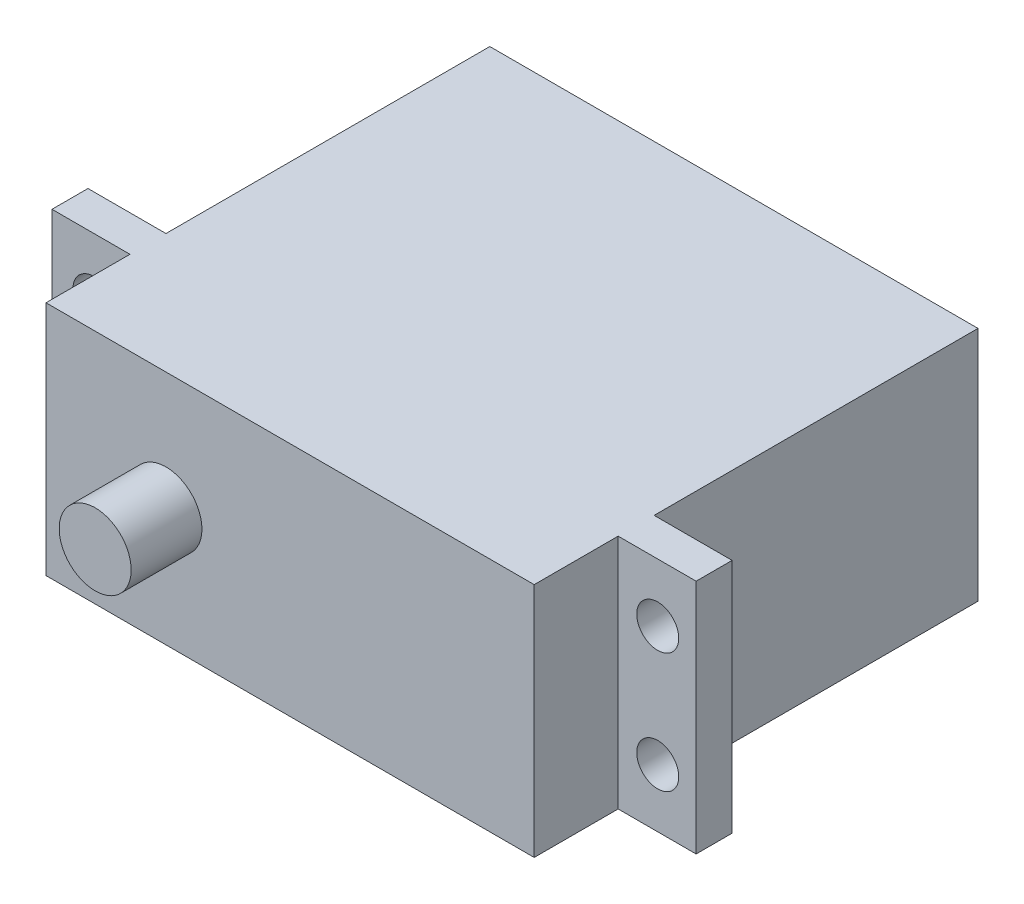
ISO-10303-21;
HEADER;
FILE_DESCRIPTION(('STEP AP214'),'2;1');
FILE_NAME('part.step','',(''),(''),'','','');
FILE_SCHEMA(('AUTOMOTIVE_DESIGN { 1 0 10303 214 1 1 1 1 }'));
ENDSEC;
DATA;
#1=APPLICATION_CONTEXT('core data for automotive mechanical design processes');
#2=APPLICATION_PROTOCOL_DEFINITION('international standard','automotive_design',2000,#1);
#3=PRODUCT_CONTEXT('',#1,'mechanical');
#4=PRODUCT('Part','Part','',(#3));
#5=PRODUCT_RELATED_PRODUCT_CATEGORY('part','',(#4));
#6=PRODUCT_DEFINITION_FORMATION('','',#4);
#7=PRODUCT_DEFINITION_CONTEXT('part definition',#1,'design');
#8=PRODUCT_DEFINITION('design','',#6,#7);
#9=PRODUCT_DEFINITION_SHAPE('','',#8);
#10=(LENGTH_UNIT() NAMED_UNIT(*) SI_UNIT(.MILLI.,.METRE.));
#11=(NAMED_UNIT(*) PLANE_ANGLE_UNIT() SI_UNIT($,.RADIAN.));
#12=(NAMED_UNIT(*) SI_UNIT($,.STERADIAN.) SOLID_ANGLE_UNIT());
#13=UNCERTAINTY_MEASURE_WITH_UNIT(LENGTH_MEASURE(1.E-05),#10,'distance_accuracy_value','');
#14=(GEOMETRIC_REPRESENTATION_CONTEXT(3) GLOBAL_UNCERTAINTY_ASSIGNED_CONTEXT((#13)) GLOBAL_UNIT_ASSIGNED_CONTEXT((#10,
#11,#12)) REPRESENTATION_CONTEXT('',''));
#15=CARTESIAN_POINT('',(0.,0.,0.));
#16=DIRECTION('',(0.,0.,1.));
#17=DIRECTION('',(1.,0.,0.));
#18=AXIS2_PLACEMENT_3D('',#15,#16,#17);
#19=CARTESIAN_POINT('',(-10.,-9.85,7.));
#20=DIRECTION('',(1.,0.,0.));
#21=DIRECTION('',(0.,0.,-1.));
#22=AXIS2_PLACEMENT_3D('',#19,#20,#21);
#23=PLANE('',#22);
#24=DIRECTION('',(0.,1.,0.));
#25=VECTOR('',#24,1.);
#26=CARTESIAN_POINT('',(-10.,-9.85,0.));
#27=LINE('',#26,#25);
#28=CARTESIAN_POINT('',(-10.,-9.85,0.));
#29=VERTEX_POINT('',#28);
#30=CARTESIAN_POINT('',(-10.,9.85,0.));
#31=VERTEX_POINT('',#30);
#32=EDGE_CURVE('E158',#29,#31,#27,.T.);
#33=ORIENTED_EDGE('',*,*,#32,.F.);
#34=DIRECTION('',(0.,0.,-1.));
#35=VECTOR('',#34,1.);
#36=CARTESIAN_POINT('',(-10.,-9.85,7.));
#37=LINE('',#36,#35);
#38=CARTESIAN_POINT('',(-10.,-9.85,7.));
#39=VERTEX_POINT('',#38);
#40=EDGE_CURVE('E139',#39,#29,#37,.T.);
#41=ORIENTED_EDGE('',*,*,#40,.F.);
#42=DIRECTION('',(0.,-1.,0.));
#43=VECTOR('',#42,1.);
#44=CARTESIAN_POINT('',(-10.,-9.85,7.));
#45=LINE('',#44,#43);
#46=CARTESIAN_POINT('',(-10.,9.85,7.));
#47=VERTEX_POINT('',#46);
#48=EDGE_CURVE('E166',#47,#39,#45,.T.);
#49=ORIENTED_EDGE('',*,*,#48,.F.);
#50=DIRECTION('',(0.,0.,-1.));
#51=VECTOR('',#50,1.);
#52=CARTESIAN_POINT('',(-10.,9.85,7.));
#53=LINE('',#52,#51);
#54=EDGE_CURVE('E186',#47,#31,#53,.T.);
#55=ORIENTED_EDGE('',*,*,#54,.T.);
#56=EDGE_LOOP('',(#33,#41,#49,#55));
#57=FACE_BOUND('',#56,.T.);
#58=ADVANCED_FACE('F39',(#57),#23,.F.);
#59=CARTESIAN_POINT('',(30.7,-9.85,7.));
#60=DIRECTION('',(-1.,0.,0.));
#61=DIRECTION('',(0.,0.,1.));
#62=AXIS2_PLACEMENT_3D('',#59,#60,#61);
#63=PLANE('',#62);
#64=DIRECTION('',(0.,-1.,0.));
#65=VECTOR('',#64,1.);
#66=CARTESIAN_POINT('',(30.7,-9.85,0.));
#67=LINE('',#66,#65);
#68=CARTESIAN_POINT('',(30.7,9.85,0.));
#69=VERTEX_POINT('',#68);
#70=CARTESIAN_POINT('',(30.7,-9.85,0.));
#71=VERTEX_POINT('',#70);
#72=EDGE_CURVE('E48',#69,#71,#67,.T.);
#73=ORIENTED_EDGE('',*,*,#72,.F.);
#74=DIRECTION('',(0.,0.,-1.));
#75=VECTOR('',#74,1.);
#76=CARTESIAN_POINT('',(30.7,9.85,7.));
#77=LINE('',#76,#75);
#78=CARTESIAN_POINT('',(30.7,9.85,7.));
#79=VERTEX_POINT('',#78);
#80=EDGE_CURVE('E194',#79,#69,#77,.T.);
#81=ORIENTED_EDGE('',*,*,#80,.F.);
#82=DIRECTION('',(0.,1.,0.));
#83=VECTOR('',#82,1.);
#84=CARTESIAN_POINT('',(30.7,-9.85,7.));
#85=LINE('',#84,#83);
#86=CARTESIAN_POINT('',(30.7,-9.85,7.));
#87=VERTEX_POINT('',#86);
#88=EDGE_CURVE('E172',#87,#79,#85,.T.);
#89=ORIENTED_EDGE('',*,*,#88,.F.);
#90=DIRECTION('',(0.,0.,-1.));
#91=VECTOR('',#90,1.);
#92=CARTESIAN_POINT('',(30.7,-9.85,7.));
#93=LINE('',#92,#91);
#94=EDGE_CURVE('E200',#87,#71,#93,.T.);
#95=ORIENTED_EDGE('',*,*,#94,.T.);
#96=EDGE_LOOP('',(#73,#81,#89,#95));
#97=FACE_BOUND('',#96,.T.);
#98=ADVANCED_FACE('F284',(#97),#63,.F.);
#99=CARTESIAN_POINT('',(-10.,-9.85,-3.));
#100=VERTEX_POINT('',#99);
#101=CARTESIAN_POINT('',(-10.,-9.85,-30.));
#102=VERTEX_POINT('',#101);
#103=EDGE_CURVE('E199',#100,#102,#37,.T.);
#104=ORIENTED_EDGE('',*,*,#103,.F.);
#105=DIRECTION('',(0.,1.,0.));
#106=VECTOR('',#105,1.);
#107=CARTESIAN_POINT('',(-10.,-9.85,-3.));
#108=LINE('',#107,#106);
#109=CARTESIAN_POINT('',(-10.,9.85,-3.));
#110=VERTEX_POINT('',#109);
#111=EDGE_CURVE('E156',#100,#110,#108,.T.);
#112=ORIENTED_EDGE('',*,*,#111,.T.);
#113=CARTESIAN_POINT('',(-10.,9.85,-30.));
#114=VERTEX_POINT('',#113);
#115=EDGE_CURVE('E178',#110,#114,#53,.T.);
#116=ORIENTED_EDGE('',*,*,#115,.T.);
#117=DIRECTION('',(0.,-1.,0.));
#118=VECTOR('',#117,1.);
#119=CARTESIAN_POINT('',(-10.,-9.85,-30.));
#120=LINE('',#119,#118);
#121=EDGE_CURVE('E170',#114,#102,#120,.T.);
#122=ORIENTED_EDGE('',*,*,#121,.T.);
#123=EDGE_LOOP('',(#104,#112,#116,#122));
#124=FACE_BOUND('',#123,.T.);
#125=ADVANCED_FACE('F41',(#124),#23,.F.);
#126=CARTESIAN_POINT('',(-10.,-9.85,7.));
#127=DIRECTION('',(0.,1.,0.));
#128=DIRECTION('',(0.,0.,1.));
#129=AXIS2_PLACEMENT_3D('',#126,#127,#128);
#130=PLANE('',#129);
#131=ORIENTED_EDGE('',*,*,#40,.T.);
#132=DIRECTION('',(1.,0.,0.));
#133=VECTOR('',#132,1.);
#134=CARTESIAN_POINT('',(-16.5,-9.85,0.));
#135=LINE('',#134,#133);
#136=CARTESIAN_POINT('',(-16.5,-9.85,0.));
#137=VERTEX_POINT('',#136);
#138=EDGE_CURVE('E128',#137,#29,#135,.T.);
#139=ORIENTED_EDGE('',*,*,#138,.F.);
#140=DIRECTION('',(0.,0.,-1.));
#141=VECTOR('',#140,1.);
#142=CARTESIAN_POINT('',(-16.5,-9.85,0.));
#143=LINE('',#142,#141);
#144=CARTESIAN_POINT('',(-16.5,-9.85,-3.));
#145=VERTEX_POINT('',#144);
#146=EDGE_CURVE('E134',#137,#145,#143,.T.);
#147=ORIENTED_EDGE('',*,*,#146,.T.);
#148=DIRECTION('',(1.,0.,0.));
#149=VECTOR('',#148,1.);
#150=CARTESIAN_POINT('',(-16.5,-9.85,-3.));
#151=LINE('',#150,#149);
#152=EDGE_CURVE('E236',#145,#100,#151,.T.);
#153=ORIENTED_EDGE('',*,*,#152,.T.);
#154=ORIENTED_EDGE('',*,*,#103,.T.);
#155=DIRECTION('',(1.,0.,0.));
#156=VECTOR('',#155,1.);
#157=CARTESIAN_POINT('',(-10.,-9.85,-30.));
#158=LINE('',#157,#156);
#159=CARTESIAN_POINT('',(30.7,-9.85,-30.));
#160=VERTEX_POINT('',#159);
#161=EDGE_CURVE('E181',#102,#160,#158,.T.);
#162=ORIENTED_EDGE('',*,*,#161,.T.);
#163=CARTESIAN_POINT('',(30.7,-9.85,-3.));
#164=VERTEX_POINT('',#163);
#165=EDGE_CURVE('E196',#164,#160,#93,.T.);
#166=ORIENTED_EDGE('',*,*,#165,.F.);
#167=CARTESIAN_POINT('',(37.2,-9.85,-3.));
#168=VERTEX_POINT('',#167);
#169=EDGE_CURVE('E61',#164,#168,#151,.T.);
#170=ORIENTED_EDGE('',*,*,#169,.T.);
#171=DIRECTION('',(0.,0.,-1.));
#172=VECTOR('',#171,1.);
#173=CARTESIAN_POINT('',(37.2,-9.85,0.));
#174=LINE('',#173,#172);
#175=CARTESIAN_POINT('',(37.2,-9.85,0.));
#176=VERTEX_POINT('',#175);
#177=EDGE_CURVE('E157',#176,#168,#174,.T.);
#178=ORIENTED_EDGE('',*,*,#177,.F.);
#179=EDGE_CURVE('E145',#71,#176,#135,.T.);
#180=ORIENTED_EDGE('',*,*,#179,.F.);
#181=ORIENTED_EDGE('',*,*,#94,.F.);
#182=DIRECTION('',(1.,0.,0.));
#183=VECTOR('',#182,1.);
#184=CARTESIAN_POINT('',(-10.,-9.85,7.));
#185=LINE('',#184,#183);
#186=EDGE_CURVE('E171',#39,#87,#185,.T.);
#187=ORIENTED_EDGE('',*,*,#186,.F.);
#188=EDGE_LOOP('',(#131,#139,#147,#153,#154,#162,#166,#170,#178,#180,#181,#187));
#189=FACE_BOUND('',#188,.T.);
#190=ADVANCED_FACE('F135',(#189),#130,.F.);
#191=CARTESIAN_POINT('',(30.7,9.85,-3.));
#192=VERTEX_POINT('',#191);
#193=CARTESIAN_POINT('',(30.7,9.85,-30.));
#194=VERTEX_POINT('',#193);
#195=EDGE_CURVE('E195',#192,#194,#77,.T.);
#196=ORIENTED_EDGE('',*,*,#195,.F.);
#197=DIRECTION('',(0.,-1.,0.));
#198=VECTOR('',#197,1.);
#199=CARTESIAN_POINT('',(30.7,-9.85,-3.));
#200=LINE('',#199,#198);
#201=EDGE_CURVE('E202',#192,#164,#200,.T.);
#202=ORIENTED_EDGE('',*,*,#201,.T.);
#203=ORIENTED_EDGE('',*,*,#165,.T.);
#204=DIRECTION('',(0.,1.,0.));
#205=VECTOR('',#204,1.);
#206=CARTESIAN_POINT('',(30.7,-9.85,-30.));
#207=LINE('',#206,#205);
#208=EDGE_CURVE('E183',#160,#194,#207,.T.);
#209=ORIENTED_EDGE('',*,*,#208,.T.);
#210=EDGE_LOOP('',(#196,#202,#203,#209));
#211=FACE_BOUND('',#210,.T.);
#212=ADVANCED_FACE('F251',(#211),#63,.F.);
#213=CARTESIAN_POINT('',(-10.,9.85,7.));
#214=DIRECTION('',(0.,-1.,0.));
#215=DIRECTION('',(0.,0.,-1.));
#216=AXIS2_PLACEMENT_3D('',#213,#214,#215);
#217=PLANE('',#216);
#218=ORIENTED_EDGE('',*,*,#80,.T.);
#219=DIRECTION('',(-1.,0.,0.));
#220=VECTOR('',#219,1.);
#221=CARTESIAN_POINT('',(-16.5,9.85,0.));
#222=LINE('',#221,#220);
#223=CARTESIAN_POINT('',(37.2,9.85,0.));
#224=VERTEX_POINT('',#223);
#225=EDGE_CURVE('E235',#224,#69,#222,.T.);
#226=ORIENTED_EDGE('',*,*,#225,.F.);
#227=DIRECTION('',(0.,0.,-1.));
#228=VECTOR('',#227,1.);
#229=CARTESIAN_POINT('',(37.2,9.85,0.));
#230=LINE('',#229,#228);
#231=CARTESIAN_POINT('',(37.2,9.85,-3.));
#232=VERTEX_POINT('',#231);
#233=EDGE_CURVE('E162',#224,#232,#230,.T.);
#234=ORIENTED_EDGE('',*,*,#233,.T.);
#235=DIRECTION('',(-1.,0.,0.));
#236=VECTOR('',#235,1.);
#237=CARTESIAN_POINT('',(-16.5,9.85,-3.));
#238=LINE('',#237,#236);
#239=EDGE_CURVE('E155',#232,#192,#238,.T.);
#240=ORIENTED_EDGE('',*,*,#239,.T.);
#241=ORIENTED_EDGE('',*,*,#195,.T.);
#242=DIRECTION('',(-1.,0.,0.));
#243=VECTOR('',#242,1.);
#244=CARTESIAN_POINT('',(-10.,9.85,-30.));
#245=LINE('',#244,#243);
#246=EDGE_CURVE('E175',#194,#114,#245,.T.);
#247=ORIENTED_EDGE('',*,*,#246,.T.);
#248=ORIENTED_EDGE('',*,*,#115,.F.);
#249=CARTESIAN_POINT('',(-16.5,9.85,-3.));
#250=VERTEX_POINT('',#249);
#251=EDGE_CURVE('E57',#110,#250,#238,.T.);
#252=ORIENTED_EDGE('',*,*,#251,.T.);
#253=DIRECTION('',(0.,0.,-1.));
#254=VECTOR('',#253,1.);
#255=CARTESIAN_POINT('',(-16.5,9.85,0.));
#256=LINE('',#255,#254);
#257=CARTESIAN_POINT('',(-16.5,9.85,0.));
#258=VERTEX_POINT('',#257);
#259=EDGE_CURVE('E234',#258,#250,#256,.T.);
#260=ORIENTED_EDGE('',*,*,#259,.F.);
#261=EDGE_CURVE('E149',#31,#258,#222,.T.);
#262=ORIENTED_EDGE('',*,*,#261,.F.);
#263=ORIENTED_EDGE('',*,*,#54,.F.);
#264=DIRECTION('',(-1.,0.,0.));
#265=VECTOR('',#264,1.);
#266=CARTESIAN_POINT('',(-10.,9.85,7.));
#267=LINE('',#266,#265);
#268=EDGE_CURVE('E176',#79,#47,#267,.T.);
#269=ORIENTED_EDGE('',*,*,#268,.F.);
#270=EDGE_LOOP('',(#218,#226,#234,#240,#241,#247,#248,#252,#260,#262,#263,#269));
#271=FACE_BOUND('',#270,.T.);
#272=ADVANCED_FACE('F250',(#271),#217,.F.);
#273=CARTESIAN_POINT('',(0.,0.,7.));
#274=DIRECTION('',(0.,0.,-1.));
#275=DIRECTION('',(-1.,0.,0.));
#276=AXIS2_PLACEMENT_3D('',#273,#274,#275);
#277=PLANE('',#276);
#278=CARTESIAN_POINT('',(0.,0.,7.));
#279=DIRECTION('',(0.,0.,1.));
#280=DIRECTION('',(1.,0.,0.));
#281=AXIS2_PLACEMENT_3D('',#278,#279,#280);
#282=CIRCLE('',#281,3.);
#283=CARTESIAN_POINT('',(3.,0.,7.));
#284=VERTEX_POINT('',#283);
#285=EDGE_CURVE('E11',#284,#284,#282,.T.);
#286=ORIENTED_EDGE('',*,*,#285,.F.);
#287=EDGE_LOOP('',(#286));
#288=FACE_BOUND('',#287,.T.);
#289=ORIENTED_EDGE('',*,*,#48,.T.);
#290=ORIENTED_EDGE('',*,*,#186,.T.);
#291=ORIENTED_EDGE('',*,*,#88,.T.);
#292=ORIENTED_EDGE('',*,*,#268,.T.);
#293=EDGE_LOOP('',(#289,#290,#291,#292));
#294=FACE_BOUND('',#293,.T.);
#295=ADVANCED_FACE('F303',(#288,#294),#277,.F.);
#296=CARTESIAN_POINT('',(0.,0.,-30.));
#297=DIRECTION('',(0.,0.,-1.));
#298=DIRECTION('',(-1.,0.,0.));
#299=AXIS2_PLACEMENT_3D('',#296,#297,#298);
#300=PLANE('',#299);
#301=ORIENTED_EDGE('',*,*,#121,.F.);
#302=ORIENTED_EDGE('',*,*,#246,.F.);
#303=ORIENTED_EDGE('',*,*,#208,.F.);
#304=ORIENTED_EDGE('',*,*,#161,.F.);
#305=EDGE_LOOP('',(#301,#302,#303,#304));
#306=FACE_BOUND('',#305,.T.);
#307=ADVANCED_FACE('F265',(#306),#300,.T.);
#308=CARTESIAN_POINT('',(37.2,-9.85,0.));
#309=DIRECTION('',(-1.,0.,0.));
#310=DIRECTION('',(0.,0.,1.));
#311=AXIS2_PLACEMENT_3D('',#308,#309,#310);
#312=PLANE('',#311);
#313=DIRECTION('',(0.,1.,0.));
#314=VECTOR('',#313,1.);
#315=CARTESIAN_POINT('',(37.2,-9.85,-3.));
#316=LINE('',#315,#314);
#317=EDGE_CURVE('E238',#168,#232,#316,.T.);
#318=ORIENTED_EDGE('',*,*,#317,.T.);
#319=ORIENTED_EDGE('',*,*,#233,.F.);
#320=DIRECTION('',(0.,1.,0.));
#321=VECTOR('',#320,1.);
#322=CARTESIAN_POINT('',(37.2,-9.85,0.));
#323=LINE('',#322,#321);
#324=EDGE_CURVE('E142',#176,#224,#323,.T.);
#325=ORIENTED_EDGE('',*,*,#324,.F.);
#326=ORIENTED_EDGE('',*,*,#177,.T.);
#327=EDGE_LOOP('',(#318,#319,#325,#326));
#328=FACE_BOUND('',#327,.T.);
#329=ADVANCED_FACE('F285',(#328),#312,.F.);
#330=CARTESIAN_POINT('',(0.,0.,-3.));
#331=DIRECTION('',(0.,0.,-1.));
#332=DIRECTION('',(-1.,0.,0.));
#333=AXIS2_PLACEMENT_3D('',#330,#331,#332);
#334=PLANE('',#333);
#335=CARTESIAN_POINT('',(34.,5.,-3.));
#336=DIRECTION('',(0.,0.,-1.));
#337=DIRECTION('',(-1.,0.,0.));
#338=AXIS2_PLACEMENT_3D('',#335,#336,#337);
#339=CIRCLE('',#338,1.75);
#340=CARTESIAN_POINT('',(32.25,5.,-3.));
#341=VERTEX_POINT('',#340);
#342=EDGE_CURVE('E225',#341,#341,#339,.F.);
#343=ORIENTED_EDGE('',*,*,#342,.T.);
#344=EDGE_LOOP('',(#343));
#345=FACE_BOUND('',#344,.T.);
#346=CARTESIAN_POINT('',(34.,-5.,-3.));
#347=DIRECTION('',(0.,0.,-1.));
#348=DIRECTION('',(-1.,0.,0.));
#349=AXIS2_PLACEMENT_3D('',#346,#347,#348);
#350=CIRCLE('',#349,1.75);
#351=CARTESIAN_POINT('',(32.25,-5.,-3.));
#352=VERTEX_POINT('',#351);
#353=EDGE_CURVE('E211',#352,#352,#350,.F.);
#354=ORIENTED_EDGE('',*,*,#353,.T.);
#355=EDGE_LOOP('',(#354));
#356=FACE_BOUND('',#355,.T.);
#357=ORIENTED_EDGE('',*,*,#201,.F.);
#358=ORIENTED_EDGE('',*,*,#239,.F.);
#359=ORIENTED_EDGE('',*,*,#317,.F.);
#360=ORIENTED_EDGE('',*,*,#169,.F.);
#361=EDGE_LOOP('',(#357,#358,#359,#360));
#362=FACE_BOUND('',#361,.T.);
#363=ADVANCED_FACE('F252',(#345,#356,#362),#334,.T.);
#364=CARTESIAN_POINT('',(0.,0.,0.));
#365=DIRECTION('',(0.,0.,-1.));
#366=DIRECTION('',(-1.,0.,0.));
#367=AXIS2_PLACEMENT_3D('',#364,#365,#366);
#368=PLANE('',#367);
#369=CARTESIAN_POINT('',(34.,5.,0.));
#370=DIRECTION('',(0.,0.,-1.));
#371=DIRECTION('',(-1.,0.,0.));
#372=AXIS2_PLACEMENT_3D('',#369,#370,#371);
#373=CIRCLE('',#372,1.75);
#374=CARTESIAN_POINT('',(32.25,5.,0.));
#375=VERTEX_POINT('',#374);
#376=EDGE_CURVE('E43',#375,#375,#373,.F.);
#377=ORIENTED_EDGE('',*,*,#376,.F.);
#378=EDGE_LOOP('',(#377));
#379=FACE_BOUND('',#378,.T.);
#380=CARTESIAN_POINT('',(34.,-5.,0.));
#381=DIRECTION('',(0.,0.,-1.));
#382=DIRECTION('',(-1.,0.,0.));
#383=AXIS2_PLACEMENT_3D('',#380,#381,#382);
#384=CIRCLE('',#383,1.75);
#385=CARTESIAN_POINT('',(32.25,-5.,0.));
#386=VERTEX_POINT('',#385);
#387=EDGE_CURVE('E215',#386,#386,#384,.F.);
#388=ORIENTED_EDGE('',*,*,#387,.F.);
#389=EDGE_LOOP('',(#388));
#390=FACE_BOUND('',#389,.T.);
#391=ORIENTED_EDGE('',*,*,#225,.T.);
#392=ORIENTED_EDGE('',*,*,#72,.T.);
#393=ORIENTED_EDGE('',*,*,#179,.T.);
#394=ORIENTED_EDGE('',*,*,#324,.T.);
#395=EDGE_LOOP('',(#391,#392,#393,#394));
#396=FACE_BOUND('',#395,.T.);
#397=ADVANCED_FACE('F277',(#379,#390,#396),#368,.F.);
#398=CARTESIAN_POINT('',(-13.,-5.,0.));
#399=DIRECTION('',(0.,0.,-1.));
#400=DIRECTION('',(-1.,0.,0.));
#401=AXIS2_PLACEMENT_3D('',#398,#399,#400);
#402=CIRCLE('',#401,1.75);
#403=CARTESIAN_POINT('',(-14.75,-5.,0.));
#404=VERTEX_POINT('',#403);
#405=EDGE_CURVE('E212',#404,#404,#402,.F.);
#406=ORIENTED_EDGE('',*,*,#405,.F.);
#407=EDGE_LOOP('',(#406));
#408=FACE_BOUND('',#407,.T.);
#409=CARTESIAN_POINT('',(-13.,5.,0.));
#410=DIRECTION('',(0.,0.,-1.));
#411=DIRECTION('',(-1.,0.,0.));
#412=AXIS2_PLACEMENT_3D('',#409,#410,#411);
#413=CIRCLE('',#412,1.75);
#414=CARTESIAN_POINT('',(-14.75,5.,0.));
#415=VERTEX_POINT('',#414);
#416=EDGE_CURVE('E206',#415,#415,#413,.F.);
#417=ORIENTED_EDGE('',*,*,#416,.F.);
#418=EDGE_LOOP('',(#417));
#419=FACE_BOUND('',#418,.T.);
#420=ORIENTED_EDGE('',*,*,#138,.T.);
#421=ORIENTED_EDGE('',*,*,#32,.T.);
#422=ORIENTED_EDGE('',*,*,#261,.T.);
#423=DIRECTION('',(0.,-1.,0.));
#424=VECTOR('',#423,1.);
#425=CARTESIAN_POINT('',(-16.5,-9.85,0.));
#426=LINE('',#425,#424);
#427=EDGE_CURVE('E143',#258,#137,#426,.T.);
#428=ORIENTED_EDGE('',*,*,#427,.T.);
#429=EDGE_LOOP('',(#420,#421,#422,#428));
#430=FACE_BOUND('',#429,.T.);
#431=ADVANCED_FACE('F147',(#408,#419,#430),#368,.F.);
#432=CARTESIAN_POINT('',(-13.,-5.,-3.));
#433=DIRECTION('',(0.,0.,-1.));
#434=DIRECTION('',(-1.,0.,0.));
#435=AXIS2_PLACEMENT_3D('',#432,#433,#434);
#436=CIRCLE('',#435,1.75);
#437=CARTESIAN_POINT('',(-14.75,-5.,-3.));
#438=VERTEX_POINT('',#437);
#439=EDGE_CURVE('E209',#438,#438,#436,.F.);
#440=ORIENTED_EDGE('',*,*,#439,.T.);
#441=EDGE_LOOP('',(#440));
#442=FACE_BOUND('',#441,.T.);
#443=CARTESIAN_POINT('',(-13.,5.,-3.));
#444=DIRECTION('',(0.,0.,-1.));
#445=DIRECTION('',(-1.,0.,0.));
#446=AXIS2_PLACEMENT_3D('',#443,#444,#445);
#447=CIRCLE('',#446,1.75);
#448=CARTESIAN_POINT('',(-14.75,5.,-3.));
#449=VERTEX_POINT('',#448);
#450=EDGE_CURVE('E205',#449,#449,#447,.F.);
#451=ORIENTED_EDGE('',*,*,#450,.T.);
#452=EDGE_LOOP('',(#451));
#453=FACE_BOUND('',#452,.T.);
#454=ORIENTED_EDGE('',*,*,#111,.F.);
#455=ORIENTED_EDGE('',*,*,#152,.F.);
#456=DIRECTION('',(0.,-1.,0.));
#457=VECTOR('',#456,1.);
#458=CARTESIAN_POINT('',(-16.5,-9.85,-3.));
#459=LINE('',#458,#457);
#460=EDGE_CURVE('E154',#250,#145,#459,.T.);
#461=ORIENTED_EDGE('',*,*,#460,.F.);
#462=ORIENTED_EDGE('',*,*,#251,.F.);
#463=EDGE_LOOP('',(#454,#455,#461,#462));
#464=FACE_BOUND('',#463,.T.);
#465=ADVANCED_FACE('F264',(#442,#453,#464),#334,.T.);
#466=CARTESIAN_POINT('',(-16.5,-9.85,0.));
#467=DIRECTION('',(1.,0.,0.));
#468=DIRECTION('',(0.,0.,-1.));
#469=AXIS2_PLACEMENT_3D('',#466,#467,#468);
#470=PLANE('',#469);
#471=ORIENTED_EDGE('',*,*,#460,.T.);
#472=ORIENTED_EDGE('',*,*,#146,.F.);
#473=ORIENTED_EDGE('',*,*,#427,.F.);
#474=ORIENTED_EDGE('',*,*,#259,.T.);
#475=EDGE_LOOP('',(#471,#472,#473,#474));
#476=FACE_BOUND('',#475,.T.);
#477=ADVANCED_FACE('F153',(#476),#470,.F.);
#478=CARTESIAN_POINT('',(0.,0.,12.9));
#479=DIRECTION('',(0.,0.,-1.));
#480=DIRECTION('',(-1.,0.,0.));
#481=AXIS2_PLACEMENT_3D('',#478,#479,#480);
#482=CYLINDRICAL_SURFACE('',#481,3.);
#483=CARTESIAN_POINT('',(0.,0.,12.9));
#484=DIRECTION('',(0.,0.,1.));
#485=DIRECTION('',(1.,0.,0.));
#486=AXIS2_PLACEMENT_3D('',#483,#484,#485);
#487=CIRCLE('',#486,3.);
#488=CARTESIAN_POINT('',(3.,0.,12.9));
#489=VERTEX_POINT('',#488);
#490=EDGE_CURVE('E226',#489,#489,#487,.T.);
#491=ORIENTED_EDGE('',*,*,#490,.F.);
#492=EDGE_LOOP('',(#491));
#493=FACE_BOUND('',#492,.T.);
#494=ORIENTED_EDGE('',*,*,#285,.T.);
#495=EDGE_LOOP('',(#494));
#496=FACE_BOUND('',#495,.T.);
#497=ADVANCED_FACE('F274',(#493,#496),#482,.T.);
#498=CARTESIAN_POINT('',(0.,0.,12.9));
#499=DIRECTION('',(0.,0.,1.));
#500=DIRECTION('',(1.,0.,0.));
#501=AXIS2_PLACEMENT_3D('',#498,#499,#500);
#502=PLANE('',#501);
#503=ORIENTED_EDGE('',*,*,#490,.T.);
#504=EDGE_LOOP('',(#503));
#505=FACE_BOUND('',#504,.T.);
#506=ADVANCED_FACE('F328',(#505),#502,.T.);
#507=CARTESIAN_POINT('',(-13.,5.,12.9));
#508=DIRECTION('',(0.,0.,-1.));
#509=DIRECTION('',(-1.,0.,0.));
#510=AXIS2_PLACEMENT_3D('',#507,#508,#509);
#511=CYLINDRICAL_SURFACE('',#510,1.75);
#512=ORIENTED_EDGE('',*,*,#450,.F.);
#513=EDGE_LOOP('',(#512));
#514=FACE_BOUND('',#513,.T.);
#515=ORIENTED_EDGE('',*,*,#416,.T.);
#516=EDGE_LOOP('',(#515));
#517=FACE_BOUND('',#516,.T.);
#518=ADVANCED_FACE('F334',(#514,#517),#511,.F.);
#519=CARTESIAN_POINT('',(-13.,-5.,12.9));
#520=DIRECTION('',(0.,0.,-1.));
#521=DIRECTION('',(-1.,0.,0.));
#522=AXIS2_PLACEMENT_3D('',#519,#520,#521);
#523=CYLINDRICAL_SURFACE('',#522,1.75);
#524=ORIENTED_EDGE('',*,*,#439,.F.);
#525=EDGE_LOOP('',(#524));
#526=FACE_BOUND('',#525,.T.);
#527=ORIENTED_EDGE('',*,*,#405,.T.);
#528=EDGE_LOOP('',(#527));
#529=FACE_BOUND('',#528,.T.);
#530=ADVANCED_FACE('F337',(#526,#529),#523,.F.);
#531=CARTESIAN_POINT('',(34.,-5.,12.9));
#532=DIRECTION('',(0.,0.,-1.));
#533=DIRECTION('',(-1.,0.,0.));
#534=AXIS2_PLACEMENT_3D('',#531,#532,#533);
#535=CYLINDRICAL_SURFACE('',#534,1.75);
#536=ORIENTED_EDGE('',*,*,#353,.F.);
#537=EDGE_LOOP('',(#536));
#538=FACE_BOUND('',#537,.T.);
#539=ORIENTED_EDGE('',*,*,#387,.T.);
#540=EDGE_LOOP('',(#539));
#541=FACE_BOUND('',#540,.T.);
#542=ADVANCED_FACE('F342',(#538,#541),#535,.F.);
#543=CARTESIAN_POINT('',(34.,5.,12.9));
#544=DIRECTION('',(0.,0.,-1.));
#545=DIRECTION('',(-1.,0.,0.));
#546=AXIS2_PLACEMENT_3D('',#543,#544,#545);
#547=CYLINDRICAL_SURFACE('',#546,1.75);
#548=ORIENTED_EDGE('',*,*,#342,.F.);
#549=EDGE_LOOP('',(#548));
#550=FACE_BOUND('',#549,.T.);
#551=ORIENTED_EDGE('',*,*,#376,.T.);
#552=EDGE_LOOP('',(#551));
#553=FACE_BOUND('',#552,.T.);
#554=ADVANCED_FACE('F336',(#550,#553),#547,.F.);
#555=CLOSED_SHELL('',(#58,#98,#125,#190,#212,#272,#295,#307,#329,#363,#397,#431,#465,#477,#497,
#506,#518,#530,#542,#554));
#556=MANIFOLD_SOLID_BREP('B2',#555);
#557=ADVANCED_BREP_SHAPE_REPRESENTATION('',(#18,#556),#14);
#558=SHAPE_DEFINITION_REPRESENTATION(#9,#557);
ENDSEC;
END-ISO-10303-21;
